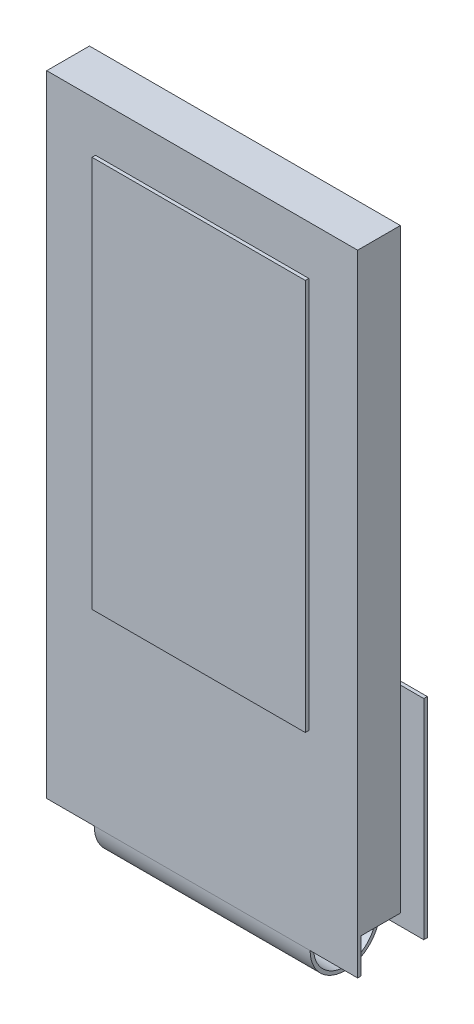
ISO-10303-21;
HEADER;
FILE_DESCRIPTION(('STEP AP214'),'2;1');
FILE_NAME('part.step','',(''),(''),'','','');
FILE_SCHEMA(('AUTOMOTIVE_DESIGN { 1 0 10303 214 1 1 1 1 }'));
ENDSEC;
DATA;
#1=APPLICATION_CONTEXT('core data for automotive mechanical design processes');
#2=APPLICATION_PROTOCOL_DEFINITION('international standard','automotive_design',2000,#1);
#3=PRODUCT_CONTEXT('',#1,'mechanical');
#4=PRODUCT('Part','Part','',(#3));
#5=PRODUCT_RELATED_PRODUCT_CATEGORY('part','',(#4));
#6=PRODUCT_DEFINITION_FORMATION('','',#4);
#7=PRODUCT_DEFINITION_CONTEXT('part definition',#1,'design');
#8=PRODUCT_DEFINITION('design','',#6,#7);
#9=PRODUCT_DEFINITION_SHAPE('','',#8);
#10=(LENGTH_UNIT() NAMED_UNIT(*) SI_UNIT(.MILLI.,.METRE.));
#11=(NAMED_UNIT(*) PLANE_ANGLE_UNIT() SI_UNIT($,.RADIAN.));
#12=(NAMED_UNIT(*) SI_UNIT($,.STERADIAN.) SOLID_ANGLE_UNIT());
#13=UNCERTAINTY_MEASURE_WITH_UNIT(LENGTH_MEASURE(1.E-05),#10,'distance_accuracy_value','');
#14=(GEOMETRIC_REPRESENTATION_CONTEXT(3) GLOBAL_UNCERTAINTY_ASSIGNED_CONTEXT((#13)) GLOBAL_UNIT_ASSIGNED_CONTEXT((#10,
#11,#12)) REPRESENTATION_CONTEXT('',''));
#15=CARTESIAN_POINT('',(0.,0.,0.));
#16=DIRECTION('',(0.,0.,1.));
#17=DIRECTION('',(1.,0.,0.));
#18=AXIS2_PLACEMENT_3D('',#15,#16,#17);
#19=CARTESIAN_POINT('',(4.464,-8.55,1.227));
#20=DIRECTION('',(-1.,0.,0.));
#21=DIRECTION('',(0.,0.,1.));
#22=AXIS2_PLACEMENT_3D('',#19,#20,#21);
#23=PLANE('',#22);
#24=DIRECTION('',(0.,1.,0.));
#25=VECTOR('',#24,1.);
#26=CARTESIAN_POINT('',(4.464,-8.55,1.227));
#27=LINE('',#26,#25);
#28=CARTESIAN_POINT('',(4.464,-9.55,1.227));
#29=VERTEX_POINT('',#28);
#30=CARTESIAN_POINT('',(4.464,8.55,1.227));
#31=VERTEX_POINT('',#30);
#32=EDGE_CURVE('E206',#29,#31,#27,.T.);
#33=ORIENTED_EDGE('',*,*,#32,.F.);
#34=DIRECTION('',(0.,0.,1.));
#35=VECTOR('',#34,1.);
#36=CARTESIAN_POINT('',(4.464,-9.55,-0.774));
#37=LINE('',#36,#35);
#38=CARTESIAN_POINT('',(4.464,-9.55,1.127));
#39=VERTEX_POINT('',#38);
#40=EDGE_CURVE('E421',#39,#29,#37,.T.);
#41=ORIENTED_EDGE('',*,*,#40,.F.);
#42=DIRECTION('',(0.,1.,0.));
#43=VECTOR('',#42,1.);
#44=CARTESIAN_POINT('',(4.464,-9.55,1.127));
#45=LINE('',#44,#43);
#46=CARTESIAN_POINT('',(4.464,-8.55,1.127));
#47=VERTEX_POINT('',#46);
#48=EDGE_CURVE('E260',#39,#47,#45,.T.);
#49=ORIENTED_EDGE('',*,*,#48,.T.);
#50=DIRECTION('',(0.,0.,-1.));
#51=VECTOR('',#50,1.);
#52=CARTESIAN_POINT('',(4.464,-8.55,1.227));
#53=LINE('',#52,#51);
#54=CARTESIAN_POINT('',(4.464,-8.55,0.));
#55=VERTEX_POINT('',#54);
#56=EDGE_CURVE('E69',#47,#55,#53,.T.);
#57=ORIENTED_EDGE('',*,*,#56,.T.);
#58=DIRECTION('',(0.,1.,0.));
#59=VECTOR('',#58,1.);
#60=CARTESIAN_POINT('',(4.464,-8.55,0.));
#61=LINE('',#60,#59);
#62=CARTESIAN_POINT('',(4.464,8.55,0.));
#63=VERTEX_POINT('',#62);
#64=EDGE_CURVE('E209',#55,#63,#61,.T.);
#65=ORIENTED_EDGE('',*,*,#64,.T.);
#66=DIRECTION('',(0.,0.,-1.));
#67=VECTOR('',#66,1.);
#68=CARTESIAN_POINT('',(4.464,8.55,1.227));
#69=LINE('',#68,#67);
#70=EDGE_CURVE('E11',#31,#63,#69,.T.);
#71=ORIENTED_EDGE('',*,*,#70,.F.);
#72=EDGE_LOOP('',(#33,#41,#49,#57,#65,#71));
#73=FACE_BOUND('',#72,.T.);
#74=ADVANCED_FACE('F50',(#73),#23,.F.);
#75=CARTESIAN_POINT('',(-4.464,-8.55,1.227));
#76=DIRECTION('',(1.,0.,0.));
#77=DIRECTION('',(0.,0.,-1.));
#78=AXIS2_PLACEMENT_3D('',#75,#76,#77);
#79=PLANE('',#78);
#80=DIRECTION('',(0.,-1.,0.));
#81=VECTOR('',#80,1.);
#82=CARTESIAN_POINT('',(-4.464,-9.55,1.127));
#83=LINE('',#82,#81);
#84=CARTESIAN_POINT('',(-4.464,-8.55,1.127));
#85=VERTEX_POINT('',#84);
#86=CARTESIAN_POINT('',(-4.464,-9.55,1.127));
#87=VERTEX_POINT('',#86);
#88=EDGE_CURVE('E192',#85,#87,#83,.T.);
#89=ORIENTED_EDGE('',*,*,#88,.T.);
#90=DIRECTION('',(0.,0.,1.));
#91=VECTOR('',#90,1.);
#92=CARTESIAN_POINT('',(-4.464,-9.55,-0.774));
#93=LINE('',#92,#91);
#94=CARTESIAN_POINT('',(-4.464,-9.55,1.227));
#95=VERTEX_POINT('',#94);
#96=EDGE_CURVE('E176',#87,#95,#93,.T.);
#97=ORIENTED_EDGE('',*,*,#96,.T.);
#98=DIRECTION('',(0.,-1.,0.));
#99=VECTOR('',#98,1.);
#100=CARTESIAN_POINT('',(-4.464,-8.55,1.227));
#101=LINE('',#100,#99);
#102=CARTESIAN_POINT('',(-4.464,8.55,1.227));
#103=VERTEX_POINT('',#102);
#104=EDGE_CURVE('E191',#103,#95,#101,.T.);
#105=ORIENTED_EDGE('',*,*,#104,.F.);
#106=DIRECTION('',(0.,0.,-1.));
#107=VECTOR('',#106,1.);
#108=CARTESIAN_POINT('',(-4.464,8.55,1.227));
#109=LINE('',#108,#107);
#110=CARTESIAN_POINT('',(-4.464,8.55,0.));
#111=VERTEX_POINT('',#110);
#112=EDGE_CURVE('E54',#103,#111,#109,.T.);
#113=ORIENTED_EDGE('',*,*,#112,.T.);
#114=DIRECTION('',(0.,-1.,0.));
#115=VECTOR('',#114,1.);
#116=CARTESIAN_POINT('',(-4.464,-8.55,0.));
#117=LINE('',#116,#115);
#118=CARTESIAN_POINT('',(-4.464,-8.55,0.));
#119=VERTEX_POINT('',#118);
#120=EDGE_CURVE('E216',#111,#119,#117,.T.);
#121=ORIENTED_EDGE('',*,*,#120,.T.);
#122=DIRECTION('',(0.,0.,-1.));
#123=VECTOR('',#122,1.);
#124=CARTESIAN_POINT('',(-4.464,-8.55,1.227));
#125=LINE('',#124,#123);
#126=EDGE_CURVE('E204',#85,#119,#125,.T.);
#127=ORIENTED_EDGE('',*,*,#126,.F.);
#128=EDGE_LOOP('',(#89,#97,#105,#113,#121,#127));
#129=FACE_BOUND('',#128,.T.);
#130=ADVANCED_FACE('F188',(#129),#79,.F.);
#131=CARTESIAN_POINT('',(0.,0.,1.227));
#132=DIRECTION('',(0.,0.,-1.));
#133=DIRECTION('',(-1.,0.,0.));
#134=AXIS2_PLACEMENT_3D('',#131,#132,#133);
#135=PLANE('',#134);
#136=ORIENTED_EDGE('',*,*,#32,.T.);
#137=DIRECTION('',(-1.,0.,0.));
#138=VECTOR('',#137,1.);
#139=CARTESIAN_POINT('',(-4.464,8.55,1.227));
#140=LINE('',#139,#138);
#141=EDGE_CURVE('E203',#31,#103,#140,.T.);
#142=ORIENTED_EDGE('',*,*,#141,.T.);
#143=ORIENTED_EDGE('',*,*,#104,.T.);
#144=DIRECTION('',(1.,0.,0.));
#145=VECTOR('',#144,1.);
#146=CARTESIAN_POINT('',(-11.7441098892805,-9.55,1.227));
#147=LINE('',#146,#145);
#148=CARTESIAN_POINT('',(-3.1,-9.55,1.227));
#149=VERTEX_POINT('',#148);
#150=EDGE_CURVE('E175',#95,#149,#147,.T.);
#151=ORIENTED_EDGE('',*,*,#150,.T.);
#152=CARTESIAN_POINT('',(3.1,-9.55,1.227));
#153=VERTEX_POINT('',#152);
#154=EDGE_CURVE('E183',#149,#153,#147,.T.);
#155=ORIENTED_EDGE('',*,*,#154,.T.);
#156=DIRECTION('',(-1.,0.,0.));
#157=VECTOR('',#156,1.);
#158=CARTESIAN_POINT('',(3.1,-9.55,1.227));
#159=LINE('',#158,#157);
#160=EDGE_CURVE('E302',#29,#153,#159,.T.);
#161=ORIENTED_EDGE('',*,*,#160,.F.);
#162=EDGE_LOOP('',(#136,#142,#143,#151,#155,#161));
#163=FACE_BOUND('',#162,.T.);
#164=DIRECTION('',(0.,1.,0.));
#165=VECTOR('',#164,1.);
#166=CARTESIAN_POINT('',(3.062,-4.097,1.227));
#167=LINE('',#166,#165);
#168=CARTESIAN_POINT('',(3.062,-4.097,1.227));
#169=VERTEX_POINT('',#168);
#170=CARTESIAN_POINT('',(3.062,7.147,1.227));
#171=VERTEX_POINT('',#170);
#172=EDGE_CURVE('E240',#169,#171,#167,.T.);
#173=ORIENTED_EDGE('',*,*,#172,.F.);
#174=DIRECTION('',(1.,0.,0.));
#175=VECTOR('',#174,1.);
#176=CARTESIAN_POINT('',(-3.062,-4.097,1.227));
#177=LINE('',#176,#175);
#178=CARTESIAN_POINT('',(-3.062,-4.097,1.227));
#179=VERTEX_POINT('',#178);
#180=EDGE_CURVE('E277',#179,#169,#177,.T.);
#181=ORIENTED_EDGE('',*,*,#180,.F.);
#182=DIRECTION('',(0.,-1.,0.));
#183=VECTOR('',#182,1.);
#184=CARTESIAN_POINT('',(-3.062,-4.097,1.227));
#185=LINE('',#184,#183);
#186=CARTESIAN_POINT('',(-3.062,7.147,1.227));
#187=VERTEX_POINT('',#186);
#188=EDGE_CURVE('E282',#187,#179,#185,.T.);
#189=ORIENTED_EDGE('',*,*,#188,.F.);
#190=DIRECTION('',(-1.,0.,0.));
#191=VECTOR('',#190,1.);
#192=CARTESIAN_POINT('',(-3.062,7.147,1.227));
#193=LINE('',#192,#191);
#194=EDGE_CURVE('E244',#171,#187,#193,.T.);
#195=ORIENTED_EDGE('',*,*,#194,.F.);
#196=EDGE_LOOP('',(#173,#181,#189,#195));
#197=FACE_BOUND('',#196,.T.);
#198=ADVANCED_FACE('F200',(#163,#197),#135,.F.);
#199=DIRECTION('',(0.,-1.,0.));
#200=VECTOR('',#199,1.);
#201=CARTESIAN_POINT('',(4.464,-3.55,-0.673));
#202=LINE('',#201,#200);
#203=CARTESIAN_POINT('',(4.464,-3.55,-0.673));
#204=VERTEX_POINT('',#203);
#205=CARTESIAN_POINT('',(4.464,-9.55,-0.673000000000001));
#206=VERTEX_POINT('',#205);
#207=EDGE_CURVE('E255',#204,#206,#202,.T.);
#208=ORIENTED_EDGE('',*,*,#207,.T.);
#209=CARTESIAN_POINT('',(4.464,-9.55,-0.773));
#210=VERTEX_POINT('',#209);
#211=EDGE_CURVE('E425',#210,#206,#37,.T.);
#212=ORIENTED_EDGE('',*,*,#211,.F.);
#213=DIRECTION('',(0.,1.,0.));
#214=VECTOR('',#213,1.);
#215=CARTESIAN_POINT('',(4.464,-9.55,-0.773));
#216=LINE('',#215,#214);
#217=CARTESIAN_POINT('',(4.464,-3.55,-0.773));
#218=VERTEX_POINT('',#217);
#219=EDGE_CURVE('E250',#210,#218,#216,.T.);
#220=ORIENTED_EDGE('',*,*,#219,.T.);
#221=DIRECTION('',(0.,0.,1.));
#222=VECTOR('',#221,1.);
#223=CARTESIAN_POINT('',(4.464,-3.55,-0.773));
#224=LINE('',#223,#222);
#225=EDGE_CURVE('E249',#218,#204,#224,.T.);
#226=ORIENTED_EDGE('',*,*,#225,.T.);
#227=EDGE_LOOP('',(#208,#212,#220,#226));
#228=FACE_BOUND('',#227,.T.);
#229=ADVANCED_FACE('F47',(#228),#23,.F.);
#230=CARTESIAN_POINT('',(-4.464,8.55,1.227));
#231=DIRECTION('',(0.,-1.,0.));
#232=DIRECTION('',(0.,0.,-1.));
#233=AXIS2_PLACEMENT_3D('',#230,#231,#232);
#234=PLANE('',#233);
#235=DIRECTION('',(-1.,0.,0.));
#236=VECTOR('',#235,1.);
#237=CARTESIAN_POINT('',(-4.464,8.55,0.));
#238=LINE('',#237,#236);
#239=EDGE_CURVE('E213',#63,#111,#238,.T.);
#240=ORIENTED_EDGE('',*,*,#239,.T.);
#241=ORIENTED_EDGE('',*,*,#112,.F.);
#242=ORIENTED_EDGE('',*,*,#141,.F.);
#243=ORIENTED_EDGE('',*,*,#70,.T.);
#244=EDGE_LOOP('',(#240,#241,#242,#243));
#245=FACE_BOUND('',#244,.T.);
#246=ADVANCED_FACE('F308',(#245),#234,.F.);
#247=DIRECTION('',(0.,-1.,0.));
#248=VECTOR('',#247,1.);
#249=CARTESIAN_POINT('',(-4.464,-9.55,-0.773));
#250=LINE('',#249,#248);
#251=CARTESIAN_POINT('',(-4.464,-3.55,-0.773));
#252=VERTEX_POINT('',#251);
#253=CARTESIAN_POINT('',(-4.464,-9.55,-0.773));
#254=VERTEX_POINT('',#253);
#255=EDGE_CURVE('E235',#252,#254,#250,.T.);
#256=ORIENTED_EDGE('',*,*,#255,.T.);
#257=CARTESIAN_POINT('',(-4.464,-9.55,-0.673000000000001));
#258=VERTEX_POINT('',#257);
#259=EDGE_CURVE('E194',#254,#258,#93,.T.);
#260=ORIENTED_EDGE('',*,*,#259,.T.);
#261=DIRECTION('',(0.,1.,0.));
#262=VECTOR('',#261,1.);
#263=CARTESIAN_POINT('',(-4.464,-3.55,-0.673));
#264=LINE('',#263,#262);
#265=CARTESIAN_POINT('',(-4.464,-3.55,-0.673));
#266=VERTEX_POINT('',#265);
#267=EDGE_CURVE('E236',#258,#266,#264,.T.);
#268=ORIENTED_EDGE('',*,*,#267,.T.);
#269=DIRECTION('',(0.,0.,-1.));
#270=VECTOR('',#269,1.);
#271=CARTESIAN_POINT('',(-4.464,-3.55,-0.773));
#272=LINE('',#271,#270);
#273=EDGE_CURVE('E245',#266,#252,#272,.T.);
#274=ORIENTED_EDGE('',*,*,#273,.T.);
#275=EDGE_LOOP('',(#256,#260,#268,#274));
#276=FACE_BOUND('',#275,.T.);
#277=ADVANCED_FACE('F306',(#276),#79,.F.);
#278=CARTESIAN_POINT('',(-4.464,-8.55,1.227));
#279=DIRECTION('',(0.,1.,0.));
#280=DIRECTION('',(0.,0.,1.));
#281=AXIS2_PLACEMENT_3D('',#278,#279,#280);
#282=PLANE('',#281);
#283=ORIENTED_EDGE('',*,*,#56,.F.);
#284=DIRECTION('',(1.,0.,0.));
#285=VECTOR('',#284,1.);
#286=CARTESIAN_POINT('',(-11.7441098892805,-8.55,1.127));
#287=LINE('',#286,#285);
#288=EDGE_CURVE('E230',#85,#47,#287,.T.);
#289=ORIENTED_EDGE('',*,*,#288,.F.);
#290=ORIENTED_EDGE('',*,*,#126,.T.);
#291=DIRECTION('',(1.,0.,0.));
#292=VECTOR('',#291,1.);
#293=CARTESIAN_POINT('',(-4.464,-8.55,0.));
#294=LINE('',#293,#292);
#295=EDGE_CURVE('E218',#119,#55,#294,.T.);
#296=ORIENTED_EDGE('',*,*,#295,.T.);
#297=EDGE_LOOP('',(#283,#289,#290,#296));
#298=FACE_BOUND('',#297,.T.);
#299=ADVANCED_FACE('F226',(#298),#282,.F.);
#300=CARTESIAN_POINT('',(0.,0.,0.));
#301=DIRECTION('',(0.,0.,-1.));
#302=DIRECTION('',(-1.,0.,0.));
#303=AXIS2_PLACEMENT_3D('',#300,#301,#302);
#304=PLANE('',#303);
#305=ORIENTED_EDGE('',*,*,#64,.F.);
#306=ORIENTED_EDGE('',*,*,#295,.F.);
#307=ORIENTED_EDGE('',*,*,#120,.F.);
#308=ORIENTED_EDGE('',*,*,#239,.F.);
#309=EDGE_LOOP('',(#305,#306,#307,#308));
#310=FACE_BOUND('',#309,.T.);
#311=ADVANCED_FACE('F229',(#310),#304,.T.);
#312=CARTESIAN_POINT('',(3.062,-4.097,1.327));
#313=DIRECTION('',(-1.,0.,0.));
#314=DIRECTION('',(0.,0.,1.));
#315=AXIS2_PLACEMENT_3D('',#312,#313,#314);
#316=PLANE('',#315);
#317=ORIENTED_EDGE('',*,*,#172,.T.);
#318=DIRECTION('',(0.,0.,-1.));
#319=VECTOR('',#318,1.);
#320=CARTESIAN_POINT('',(3.062,7.147,1.327));
#321=LINE('',#320,#319);
#322=CARTESIAN_POINT('',(3.062,7.147,1.327));
#323=VERTEX_POINT('',#322);
#324=EDGE_CURVE('E212',#323,#171,#321,.T.);
#325=ORIENTED_EDGE('',*,*,#324,.F.);
#326=DIRECTION('',(0.,1.,0.));
#327=VECTOR('',#326,1.);
#328=CARTESIAN_POINT('',(3.062,-4.097,1.327));
#329=LINE('',#328,#327);
#330=CARTESIAN_POINT('',(3.062,-4.097,1.327));
#331=VERTEX_POINT('',#330);
#332=EDGE_CURVE('E275',#331,#323,#329,.T.);
#333=ORIENTED_EDGE('',*,*,#332,.F.);
#334=DIRECTION('',(0.,0.,-1.));
#335=VECTOR('',#334,1.);
#336=CARTESIAN_POINT('',(3.062,-4.097,1.327));
#337=LINE('',#336,#335);
#338=EDGE_CURVE('E284',#331,#169,#337,.T.);
#339=ORIENTED_EDGE('',*,*,#338,.T.);
#340=EDGE_LOOP('',(#317,#325,#333,#339));
#341=FACE_BOUND('',#340,.T.);
#342=ADVANCED_FACE('F328',(#341),#316,.F.);
#343=CARTESIAN_POINT('',(-3.062,7.147,1.327));
#344=DIRECTION('',(0.,-1.,0.));
#345=DIRECTION('',(0.,0.,-1.));
#346=AXIS2_PLACEMENT_3D('',#343,#344,#345);
#347=PLANE('',#346);
#348=ORIENTED_EDGE('',*,*,#194,.T.);
#349=DIRECTION('',(0.,0.,-1.));
#350=VECTOR('',#349,1.);
#351=CARTESIAN_POINT('',(-3.062,7.147,1.327));
#352=LINE('',#351,#350);
#353=CARTESIAN_POINT('',(-3.062,7.147,1.327));
#354=VERTEX_POINT('',#353);
#355=EDGE_CURVE('E293',#354,#187,#352,.T.);
#356=ORIENTED_EDGE('',*,*,#355,.F.);
#357=DIRECTION('',(-1.,0.,0.));
#358=VECTOR('',#357,1.);
#359=CARTESIAN_POINT('',(-3.062,7.147,1.327));
#360=LINE('',#359,#358);
#361=EDGE_CURVE('E274',#323,#354,#360,.T.);
#362=ORIENTED_EDGE('',*,*,#361,.F.);
#363=ORIENTED_EDGE('',*,*,#324,.T.);
#364=EDGE_LOOP('',(#348,#356,#362,#363));
#365=FACE_BOUND('',#364,.T.);
#366=ADVANCED_FACE('F334',(#365),#347,.F.);
#367=CARTESIAN_POINT('',(-3.062,-4.097,1.327));
#368=DIRECTION('',(1.,0.,0.));
#369=DIRECTION('',(0.,0.,-1.));
#370=AXIS2_PLACEMENT_3D('',#367,#368,#369);
#371=PLANE('',#370);
#372=ORIENTED_EDGE('',*,*,#188,.T.);
#373=DIRECTION('',(0.,0.,-1.));
#374=VECTOR('',#373,1.);
#375=CARTESIAN_POINT('',(-3.062,-4.097,1.327));
#376=LINE('',#375,#374);
#377=CARTESIAN_POINT('',(-3.062,-4.097,1.327));
#378=VERTEX_POINT('',#377);
#379=EDGE_CURVE('E295',#378,#179,#376,.T.);
#380=ORIENTED_EDGE('',*,*,#379,.F.);
#381=DIRECTION('',(0.,-1.,0.));
#382=VECTOR('',#381,1.);
#383=CARTESIAN_POINT('',(-3.062,-4.097,1.327));
#384=LINE('',#383,#382);
#385=EDGE_CURVE('E279',#354,#378,#384,.T.);
#386=ORIENTED_EDGE('',*,*,#385,.F.);
#387=ORIENTED_EDGE('',*,*,#355,.T.);
#388=EDGE_LOOP('',(#372,#380,#386,#387));
#389=FACE_BOUND('',#388,.T.);
#390=ADVANCED_FACE('F336',(#389),#371,.F.);
#391=CARTESIAN_POINT('',(-3.062,-4.097,1.327));
#392=DIRECTION('',(0.,1.,0.));
#393=DIRECTION('',(0.,0.,1.));
#394=AXIS2_PLACEMENT_3D('',#391,#392,#393);
#395=PLANE('',#394);
#396=ORIENTED_EDGE('',*,*,#180,.T.);
#397=ORIENTED_EDGE('',*,*,#338,.F.);
#398=DIRECTION('',(1.,0.,0.));
#399=VECTOR('',#398,1.);
#400=CARTESIAN_POINT('',(-3.062,-4.097,1.327));
#401=LINE('',#400,#399);
#402=EDGE_CURVE('E278',#378,#331,#401,.T.);
#403=ORIENTED_EDGE('',*,*,#402,.F.);
#404=ORIENTED_EDGE('',*,*,#379,.T.);
#405=EDGE_LOOP('',(#396,#397,#403,#404));
#406=FACE_BOUND('',#405,.T.);
#407=ADVANCED_FACE('F341',(#406),#395,.F.);
#408=CARTESIAN_POINT('',(0.,0.,1.327));
#409=DIRECTION('',(0.,0.,-1.));
#410=DIRECTION('',(-1.,0.,0.));
#411=AXIS2_PLACEMENT_3D('',#408,#409,#410);
#412=PLANE('',#411);
#413=ORIENTED_EDGE('',*,*,#332,.T.);
#414=ORIENTED_EDGE('',*,*,#361,.T.);
#415=ORIENTED_EDGE('',*,*,#385,.T.);
#416=ORIENTED_EDGE('',*,*,#402,.T.);
#417=EDGE_LOOP('',(#413,#414,#415,#416));
#418=FACE_BOUND('',#417,.T.);
#419=ADVANCED_FACE('F344',(#418),#412,.F.);
#420=CARTESIAN_POINT('',(-11.7441098892805,-9.55,1.127));
#421=DIRECTION('',(0.,0.,-1.));
#422=DIRECTION('',(0.,1.,0.));
#423=AXIS2_PLACEMENT_3D('',#420,#421,#422);
#424=PLANE('',#423);
#425=ORIENTED_EDGE('',*,*,#88,.F.);
#426=ORIENTED_EDGE('',*,*,#288,.T.);
#427=ORIENTED_EDGE('',*,*,#48,.F.);
#428=DIRECTION('',(1.,0.,0.));
#429=VECTOR('',#428,1.);
#430=CARTESIAN_POINT('',(-11.7441098892805,-9.55,1.127));
#431=LINE('',#430,#429);
#432=CARTESIAN_POINT('',(3.1,-9.55,1.127));
#433=VERTEX_POINT('',#432);
#434=EDGE_CURVE('E407',#433,#39,#431,.T.);
#435=ORIENTED_EDGE('',*,*,#434,.F.);
#436=DIRECTION('',(1.,0.,0.));
#437=VECTOR('',#436,1.);
#438=CARTESIAN_POINT('',(-11.7441098892805,-9.55,1.127));
#439=LINE('',#438,#437);
#440=CARTESIAN_POINT('',(-3.1,-9.55,1.127));
#441=VERTEX_POINT('',#440);
#442=EDGE_CURVE('E257',#441,#433,#439,.T.);
#443=ORIENTED_EDGE('',*,*,#442,.F.);
#444=EDGE_CURVE('E232',#87,#441,#439,.T.);
#445=ORIENTED_EDGE('',*,*,#444,.F.);
#446=EDGE_LOOP('',(#425,#426,#427,#435,#443,#445));
#447=FACE_BOUND('',#446,.T.);
#448=ADVANCED_FACE('F234',(#447),#424,.T.);
#449=CARTESIAN_POINT('',(-11.7441098892805,-9.55,0.226999999999999));
#450=DIRECTION('',(1.,0.,0.));
#451=DIRECTION('',(0.,0.,-1.));
#452=AXIS2_PLACEMENT_3D('',#449,#450,#451);
#453=CYLINDRICAL_SURFACE('',#452,0.900000000000001);
#454=CARTESIAN_POINT('',(-3.1,-9.55,0.226999999999999));
#455=DIRECTION('',(1.,0.,0.));
#456=DIRECTION('',(0.,0.,-1.));
#457=AXIS2_PLACEMENT_3D('',#454,#455,#456);
#458=CIRCLE('',#457,0.900000000000001);
#459=CARTESIAN_POINT('',(-3.1,-9.55,-0.673000000000001));
#460=VERTEX_POINT('',#459);
#461=EDGE_CURVE('E198',#460,#441,#458,.F.);
#462=ORIENTED_EDGE('',*,*,#461,.T.);
#463=ORIENTED_EDGE('',*,*,#442,.T.);
#464=CARTESIAN_POINT('',(3.1,-9.55,0.226999999999999));
#465=DIRECTION('',(-1.,0.,0.));
#466=DIRECTION('',(0.,0.,1.));
#467=AXIS2_PLACEMENT_3D('',#464,#465,#466);
#468=CIRCLE('',#467,0.900000000000001);
#469=CARTESIAN_POINT('',(3.1,-9.55,-0.673000000000001));
#470=VERTEX_POINT('',#469);
#471=EDGE_CURVE('E424',#433,#470,#468,.F.);
#472=ORIENTED_EDGE('',*,*,#471,.T.);
#473=DIRECTION('',(1.,0.,0.));
#474=VECTOR('',#473,1.);
#475=CARTESIAN_POINT('',(-11.7441098892805,-9.55,-0.673000000000001));
#476=LINE('',#475,#474);
#477=EDGE_CURVE('E262',#460,#470,#476,.T.);
#478=ORIENTED_EDGE('',*,*,#477,.F.);
#479=EDGE_LOOP('',(#462,#463,#472,#478));
#480=FACE_BOUND('',#479,.T.);
#481=ADVANCED_FACE('F364',(#480),#453,.F.);
#482=CARTESIAN_POINT('',(-11.7441098892805,-3.55,-0.673));
#483=DIRECTION('',(0.,0.,1.));
#484=DIRECTION('',(0.,-1.,0.));
#485=AXIS2_PLACEMENT_3D('',#482,#483,#484);
#486=PLANE('',#485);
#487=ORIENTED_EDGE('',*,*,#267,.F.);
#488=EDGE_CURVE('E261',#258,#460,#476,.T.);
#489=ORIENTED_EDGE('',*,*,#488,.T.);
#490=ORIENTED_EDGE('',*,*,#477,.T.);
#491=DIRECTION('',(1.,0.,0.));
#492=VECTOR('',#491,1.);
#493=CARTESIAN_POINT('',(-11.7441098892805,-9.55,-0.673000000000001));
#494=LINE('',#493,#492);
#495=EDGE_CURVE('E406',#470,#206,#494,.T.);
#496=ORIENTED_EDGE('',*,*,#495,.T.);
#497=ORIENTED_EDGE('',*,*,#207,.F.);
#498=DIRECTION('',(1.,0.,0.));
#499=VECTOR('',#498,1.);
#500=CARTESIAN_POINT('',(-11.7441098892805,-3.55,-0.673));
#501=LINE('',#500,#499);
#502=EDGE_CURVE('E264',#266,#204,#501,.T.);
#503=ORIENTED_EDGE('',*,*,#502,.F.);
#504=EDGE_LOOP('',(#487,#489,#490,#496,#497,#503));
#505=FACE_BOUND('',#504,.T.);
#506=ADVANCED_FACE('F363',(#505),#486,.T.);
#507=CARTESIAN_POINT('',(-11.7441098892805,-3.55,-0.773));
#508=DIRECTION('',(0.,1.,0.));
#509=DIRECTION('',(0.,0.,1.));
#510=AXIS2_PLACEMENT_3D('',#507,#508,#509);
#511=PLANE('',#510);
#512=ORIENTED_EDGE('',*,*,#273,.F.);
#513=ORIENTED_EDGE('',*,*,#502,.T.);
#514=ORIENTED_EDGE('',*,*,#225,.F.);
#515=DIRECTION('',(1.,0.,0.));
#516=VECTOR('',#515,1.);
#517=CARTESIAN_POINT('',(-11.7441098892805,-3.55,-0.773));
#518=LINE('',#517,#516);
#519=EDGE_CURVE('E270',#252,#218,#518,.T.);
#520=ORIENTED_EDGE('',*,*,#519,.F.);
#521=EDGE_LOOP('',(#512,#513,#514,#520));
#522=FACE_BOUND('',#521,.T.);
#523=ADVANCED_FACE('F357',(#522),#511,.T.);
#524=CARTESIAN_POINT('',(-11.7441098892805,-9.55,-0.773));
#525=DIRECTION('',(0.,0.,-1.));
#526=DIRECTION('',(0.,1.,0.));
#527=AXIS2_PLACEMENT_3D('',#524,#525,#526);
#528=PLANE('',#527);
#529=ORIENTED_EDGE('',*,*,#255,.F.);
#530=ORIENTED_EDGE('',*,*,#519,.T.);
#531=ORIENTED_EDGE('',*,*,#219,.F.);
#532=DIRECTION('',(1.,0.,0.));
#533=VECTOR('',#532,1.);
#534=CARTESIAN_POINT('',(-11.7441098892805,-9.55,-0.773));
#535=LINE('',#534,#533);
#536=CARTESIAN_POINT('',(3.1,-9.55,-0.773));
#537=VERTEX_POINT('',#536);
#538=EDGE_CURVE('E405',#537,#210,#535,.T.);
#539=ORIENTED_EDGE('',*,*,#538,.F.);
#540=DIRECTION('',(1.,0.,0.));
#541=VECTOR('',#540,1.);
#542=CARTESIAN_POINT('',(-11.7441098892805,-9.55,-0.773));
#543=LINE('',#542,#541);
#544=CARTESIAN_POINT('',(-3.1,-9.55,-0.773));
#545=VERTEX_POINT('',#544);
#546=EDGE_CURVE('E184',#545,#537,#543,.T.);
#547=ORIENTED_EDGE('',*,*,#546,.F.);
#548=EDGE_CURVE('E267',#254,#545,#543,.T.);
#549=ORIENTED_EDGE('',*,*,#548,.F.);
#550=EDGE_LOOP('',(#529,#530,#531,#539,#547,#549));
#551=FACE_BOUND('',#550,.T.);
#552=ADVANCED_FACE('F353',(#551),#528,.T.);
#553=CARTESIAN_POINT('',(-11.7441098892805,-9.55,0.227));
#554=DIRECTION('',(1.,0.,0.));
#555=DIRECTION('',(0.,0.,-1.));
#556=AXIS2_PLACEMENT_3D('',#553,#554,#555);
#557=CYLINDRICAL_SURFACE('',#556,1.);
#558=CARTESIAN_POINT('',(-3.1,-9.55,0.227));
#559=DIRECTION('',(1.,0.,0.));
#560=DIRECTION('',(0.,0.,-1.));
#561=AXIS2_PLACEMENT_3D('',#558,#559,#560);
#562=CIRCLE('',#561,1.);
#563=EDGE_CURVE('E394',#149,#545,#562,.T.);
#564=ORIENTED_EDGE('',*,*,#563,.T.);
#565=ORIENTED_EDGE('',*,*,#546,.T.);
#566=CARTESIAN_POINT('',(3.1,-9.55,0.227));
#567=DIRECTION('',(-1.,0.,0.));
#568=DIRECTION('',(0.,0.,1.));
#569=AXIS2_PLACEMENT_3D('',#566,#567,#568);
#570=CIRCLE('',#569,1.);
#571=EDGE_CURVE('E61',#537,#153,#570,.T.);
#572=ORIENTED_EDGE('',*,*,#571,.T.);
#573=ORIENTED_EDGE('',*,*,#154,.F.);
#574=EDGE_LOOP('',(#564,#565,#572,#573));
#575=FACE_BOUND('',#574,.T.);
#576=ADVANCED_FACE('F348',(#575),#557,.T.);
#577=CARTESIAN_POINT('',(3.1,-9.55,-0.774));
#578=DIRECTION('',(0.,1.,0.));
#579=DIRECTION('',(0.,0.,1.));
#580=AXIS2_PLACEMENT_3D('',#577,#578,#579);
#581=PLANE('',#580);
#582=ORIENTED_EDGE('',*,*,#40,.T.);
#583=ORIENTED_EDGE('',*,*,#160,.T.);
#584=DIRECTION('',(0.,0.,1.));
#585=VECTOR('',#584,1.);
#586=CARTESIAN_POINT('',(3.1,-9.55,-0.774));
#587=LINE('',#586,#585);
#588=EDGE_CURVE('E429',#433,#153,#587,.T.);
#589=ORIENTED_EDGE('',*,*,#588,.F.);
#590=ORIENTED_EDGE('',*,*,#434,.T.);
#591=EDGE_LOOP('',(#582,#583,#589,#590));
#592=FACE_BOUND('',#591,.T.);
#593=ADVANCED_FACE('F355',(#592),#581,.F.);
#594=CARTESIAN_POINT('',(3.1,-9.55,-0.774));
#595=DIRECTION('',(-1.,0.,0.));
#596=DIRECTION('',(0.,0.,1.));
#597=AXIS2_PLACEMENT_3D('',#594,#595,#596);
#598=PLANE('',#597);
#599=ORIENTED_EDGE('',*,*,#588,.T.);
#600=ORIENTED_EDGE('',*,*,#571,.F.);
#601=EDGE_CURVE('E426',#537,#470,#587,.T.);
#602=ORIENTED_EDGE('',*,*,#601,.T.);
#603=ORIENTED_EDGE('',*,*,#471,.F.);
#604=EDGE_LOOP('',(#599,#600,#602,#603));
#605=FACE_BOUND('',#604,.T.);
#606=ADVANCED_FACE('F375',(#605),#598,.F.);
#607=ORIENTED_EDGE('',*,*,#601,.F.);
#608=ORIENTED_EDGE('',*,*,#538,.T.);
#609=ORIENTED_EDGE('',*,*,#211,.T.);
#610=ORIENTED_EDGE('',*,*,#495,.F.);
#611=EDGE_LOOP('',(#607,#608,#609,#610));
#612=FACE_BOUND('',#611,.T.);
#613=ADVANCED_FACE('F374',(#612),#581,.F.);
#614=CARTESIAN_POINT('',(-4.464,-9.55,-0.774));
#615=DIRECTION('',(0.,1.,0.));
#616=DIRECTION('',(0.,0.,1.));
#617=AXIS2_PLACEMENT_3D('',#614,#615,#616);
#618=PLANE('',#617);
#619=DIRECTION('',(0.,0.,1.));
#620=VECTOR('',#619,1.);
#621=CARTESIAN_POINT('',(-3.1,-9.55,-0.774));
#622=LINE('',#621,#620);
#623=EDGE_CURVE('E178',#441,#149,#622,.T.);
#624=ORIENTED_EDGE('',*,*,#623,.T.);
#625=ORIENTED_EDGE('',*,*,#150,.F.);
#626=ORIENTED_EDGE('',*,*,#96,.F.);
#627=ORIENTED_EDGE('',*,*,#444,.T.);
#628=EDGE_LOOP('',(#624,#625,#626,#627));
#629=FACE_BOUND('',#628,.T.);
#630=ADVANCED_FACE('F172',(#629),#618,.F.);
#631=CARTESIAN_POINT('',(-3.1,-10.55,-0.774));
#632=DIRECTION('',(1.,0.,0.));
#633=DIRECTION('',(0.,0.,-1.));
#634=AXIS2_PLACEMENT_3D('',#631,#632,#633);
#635=PLANE('',#634);
#636=EDGE_CURVE('E253',#545,#460,#622,.T.);
#637=ORIENTED_EDGE('',*,*,#636,.F.);
#638=ORIENTED_EDGE('',*,*,#563,.F.);
#639=ORIENTED_EDGE('',*,*,#623,.F.);
#640=ORIENTED_EDGE('',*,*,#461,.F.);
#641=EDGE_LOOP('',(#637,#638,#639,#640));
#642=FACE_BOUND('',#641,.T.);
#643=ADVANCED_FACE('F385',(#642),#635,.F.);
#644=ORIENTED_EDGE('',*,*,#259,.F.);
#645=ORIENTED_EDGE('',*,*,#548,.T.);
#646=ORIENTED_EDGE('',*,*,#636,.T.);
#647=ORIENTED_EDGE('',*,*,#488,.F.);
#648=EDGE_LOOP('',(#644,#645,#646,#647));
#649=FACE_BOUND('',#648,.T.);
#650=ADVANCED_FACE('F377',(#649),#618,.F.);
#651=CLOSED_SHELL('',(#74,#130,#198,#229,#246,#277,#299,#311,#342,#366,#390,#407,#419,#448,#481,
#506,#523,#552,#576,#593,#606,#613,#630,#643,#650));
#652=MANIFOLD_SOLID_BREP('B2',#651);
#653=ADVANCED_BREP_SHAPE_REPRESENTATION('',(#18,#652),#14);
#654=SHAPE_DEFINITION_REPRESENTATION(#9,#653);
ENDSEC;
END-ISO-10303-21;
